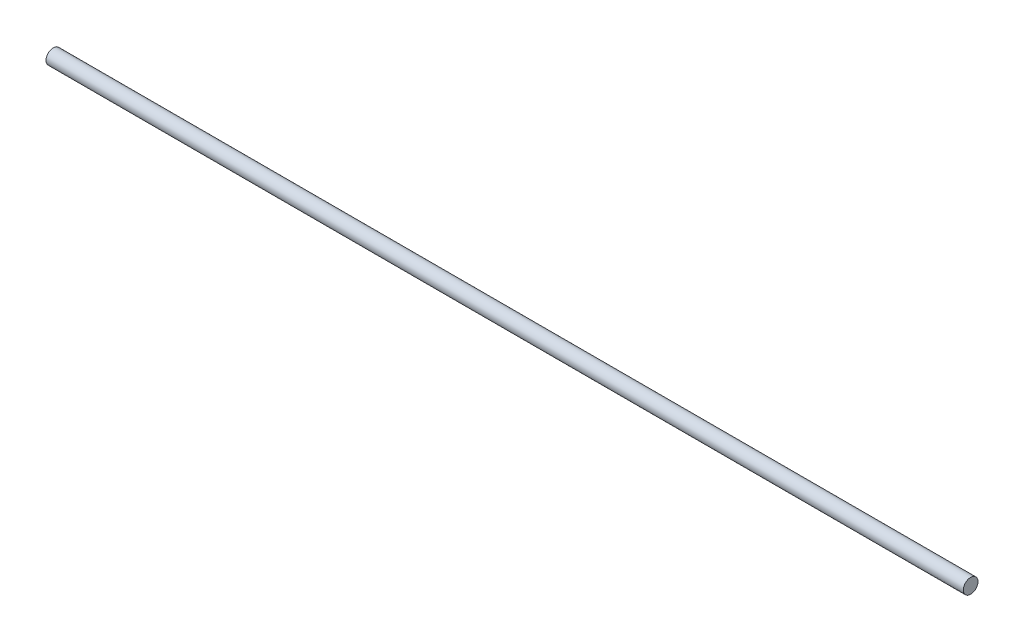
ISO-10303-21;
HEADER;
FILE_DESCRIPTION(('STEP AP214'),'2;1');
FILE_NAME('part.step','',(''),(''),'','','');
FILE_SCHEMA(('AUTOMOTIVE_DESIGN { 1 0 10303 214 1 1 1 1 }'));
ENDSEC;
DATA;
#1=APPLICATION_CONTEXT('core data for automotive mechanical design processes');
#2=APPLICATION_PROTOCOL_DEFINITION('international standard','automotive_design',2000,#1);
#3=PRODUCT_CONTEXT('',#1,'mechanical');
#4=PRODUCT('Part','Part','',(#3));
#5=PRODUCT_RELATED_PRODUCT_CATEGORY('part','',(#4));
#6=PRODUCT_DEFINITION_FORMATION('','',#4);
#7=PRODUCT_DEFINITION_CONTEXT('part definition',#1,'design');
#8=PRODUCT_DEFINITION('design','',#6,#7);
#9=PRODUCT_DEFINITION_SHAPE('','',#8);
#10=(LENGTH_UNIT() NAMED_UNIT(*) SI_UNIT(.MILLI.,.METRE.));
#11=(NAMED_UNIT(*) PLANE_ANGLE_UNIT() SI_UNIT($,.RADIAN.));
#12=(NAMED_UNIT(*) SI_UNIT($,.STERADIAN.) SOLID_ANGLE_UNIT());
#13=UNCERTAINTY_MEASURE_WITH_UNIT(LENGTH_MEASURE(1.E-05),#10,'distance_accuracy_value','');
#14=(GEOMETRIC_REPRESENTATION_CONTEXT(3) GLOBAL_UNCERTAINTY_ASSIGNED_CONTEXT((#13)) GLOBAL_UNIT_ASSIGNED_CONTEXT((#10,
#11,#12)) REPRESENTATION_CONTEXT('',''));
#15=CARTESIAN_POINT('',(0.,0.,0.));
#16=DIRECTION('',(0.,0.,1.));
#17=DIRECTION('',(1.,0.,0.));
#18=AXIS2_PLACEMENT_3D('',#15,#16,#17);
#19=CARTESIAN_POINT('',(1500.,0.,0.));
#20=DIRECTION('',(-1.,0.,0.));
#21=DIRECTION('',(0.,0.,1.));
#22=AXIS2_PLACEMENT_3D('',#19,#20,#21);
#23=CYLINDRICAL_SURFACE('',#22,12.);
#24=CARTESIAN_POINT('',(1500.,0.,0.));
#25=DIRECTION('',(1.,0.,0.));
#26=DIRECTION('',(0.,0.,-1.));
#27=AXIS2_PLACEMENT_3D('',#24,#25,#26);
#28=CIRCLE('',#27,12.);
#29=CARTESIAN_POINT('',(1500.,0.,-12.));
#30=VERTEX_POINT('',#29);
#31=EDGE_CURVE('E10',#30,#30,#28,.T.);
#32=ORIENTED_EDGE('',*,*,#31,.F.);
#33=EDGE_LOOP('',(#32));
#34=FACE_BOUND('',#33,.T.);
#35=CARTESIAN_POINT('',(0.,0.,0.));
#36=DIRECTION('',(1.,0.,0.));
#37=DIRECTION('',(0.,0.,-1.));
#38=AXIS2_PLACEMENT_3D('',#35,#36,#37);
#39=CIRCLE('',#38,12.);
#40=CARTESIAN_POINT('',(0.,0.,-12.));
#41=VERTEX_POINT('',#40);
#42=EDGE_CURVE('E40',#41,#41,#39,.T.);
#43=ORIENTED_EDGE('',*,*,#42,.T.);
#44=EDGE_LOOP('',(#43));
#45=FACE_BOUND('',#44,.T.);
#46=ADVANCED_FACE('F37',(#34,#45),#23,.T.);
#47=CARTESIAN_POINT('',(1500.,0.,0.));
#48=DIRECTION('',(1.,0.,0.));
#49=DIRECTION('',(0.,0.,-1.));
#50=AXIS2_PLACEMENT_3D('',#47,#48,#49);
#51=PLANE('',#50);
#52=ORIENTED_EDGE('',*,*,#31,.T.);
#53=EDGE_LOOP('',(#52));
#54=FACE_BOUND('',#53,.T.);
#55=ADVANCED_FACE('F54',(#54),#51,.T.);
#56=CARTESIAN_POINT('',(0.,0.,0.));
#57=DIRECTION('',(1.,0.,0.));
#58=DIRECTION('',(0.,0.,-1.));
#59=AXIS2_PLACEMENT_3D('',#56,#57,#58);
#60=PLANE('',#59);
#61=ORIENTED_EDGE('',*,*,#42,.F.);
#62=EDGE_LOOP('',(#61));
#63=FACE_BOUND('',#62,.T.);
#64=ADVANCED_FACE('F52',(#63),#60,.F.);
#65=CLOSED_SHELL('',(#46,#55,#64));
#66=MANIFOLD_SOLID_BREP('B2',#65);
#67=ADVANCED_BREP_SHAPE_REPRESENTATION('',(#18,#66),#14);
#68=SHAPE_DEFINITION_REPRESENTATION(#9,#67);
ENDSEC;
END-ISO-10303-21;
